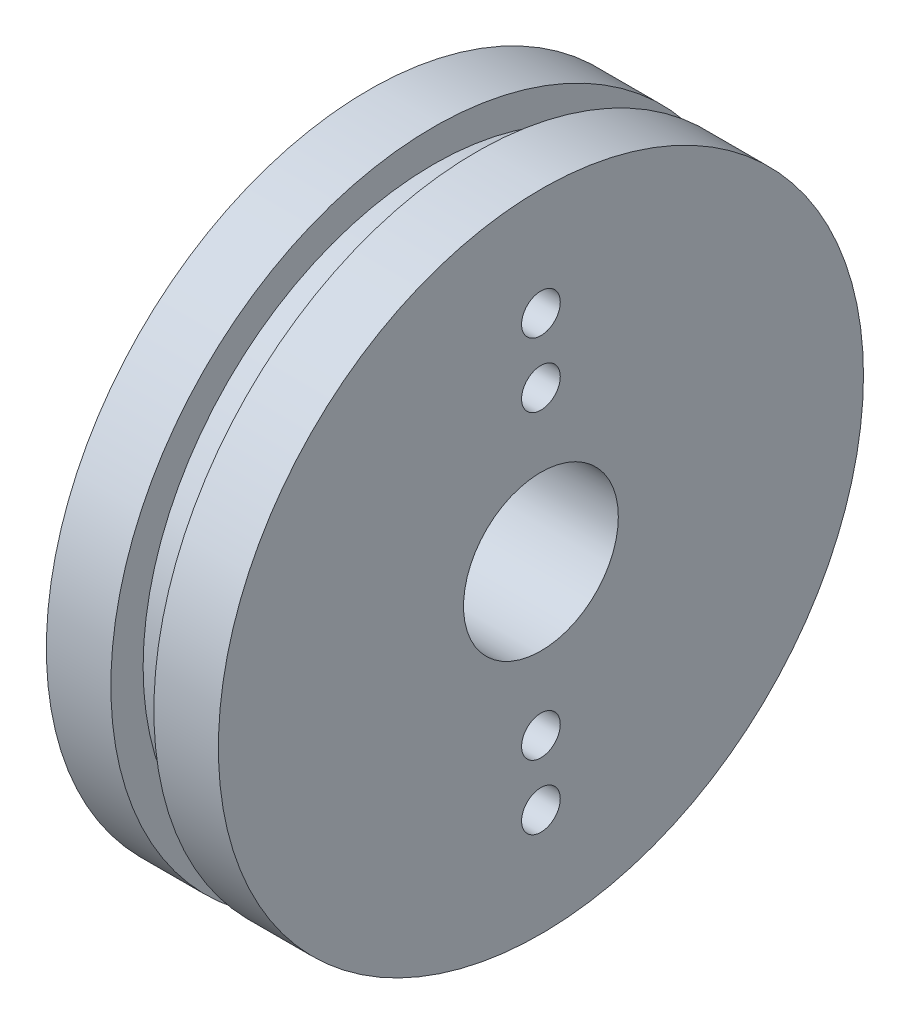
ISO-10303-21;
HEADER;
FILE_DESCRIPTION(('STEP AP214'),'2;1');
FILE_NAME('part.step','',(''),(''),'','','');
FILE_SCHEMA(('AUTOMOTIVE_DESIGN { 1 0 10303 214 1 1 1 1 }'));
ENDSEC;
DATA;
#1=APPLICATION_CONTEXT('core data for automotive mechanical design processes');
#2=APPLICATION_PROTOCOL_DEFINITION('international standard','automotive_design',2000,#1);
#3=PRODUCT_CONTEXT('',#1,'mechanical');
#4=PRODUCT('Part','Part','',(#3));
#5=PRODUCT_RELATED_PRODUCT_CATEGORY('part','',(#4));
#6=PRODUCT_DEFINITION_FORMATION('','',#4);
#7=PRODUCT_DEFINITION_CONTEXT('part definition',#1,'design');
#8=PRODUCT_DEFINITION('design','',#6,#7);
#9=PRODUCT_DEFINITION_SHAPE('','',#8);
#10=(LENGTH_UNIT() NAMED_UNIT(*) SI_UNIT(.MILLI.,.METRE.));
#11=(NAMED_UNIT(*) PLANE_ANGLE_UNIT() SI_UNIT($,.RADIAN.));
#12=(NAMED_UNIT(*) SI_UNIT($,.STERADIAN.) SOLID_ANGLE_UNIT());
#13=UNCERTAINTY_MEASURE_WITH_UNIT(LENGTH_MEASURE(1.E-05),#10,'distance_accuracy_value','');
#14=(GEOMETRIC_REPRESENTATION_CONTEXT(3) GLOBAL_UNCERTAINTY_ASSIGNED_CONTEXT((#13)) GLOBAL_UNIT_ASSIGNED_CONTEXT((#10,
#11,#12)) REPRESENTATION_CONTEXT('',''));
#15=CARTESIAN_POINT('',(0.,0.,0.));
#16=DIRECTION('',(0.,0.,1.));
#17=DIRECTION('',(1.,0.,0.));
#18=AXIS2_PLACEMENT_3D('',#15,#16,#17);
#19=CARTESIAN_POINT('',(0.,0.,0.));
#20=DIRECTION('',(1.,0.,0.));
#21=DIRECTION('',(0.,0.,-1.));
#22=AXIS2_PLACEMENT_3D('',#19,#20,#21);
#23=PLANE('',#22);
#24=CARTESIAN_POINT('',(0.,10.,0.));
#25=DIRECTION('',(1.,0.,0.));
#26=DIRECTION('',(0.,0.,-1.));
#27=AXIS2_PLACEMENT_3D('',#24,#25,#26);
#28=CIRCLE('',#27,0.9);
#29=CARTESIAN_POINT('',(0.,10.,-0.9));
#30=VERTEX_POINT('',#29);
#31=EDGE_CURVE('E78',#30,#30,#28,.F.);
#32=ORIENTED_EDGE('',*,*,#31,.F.);
#33=EDGE_LOOP('',(#32));
#34=FACE_BOUND('',#33,.T.);
#35=CARTESIAN_POINT('',(0.,7.,0.));
#36=DIRECTION('',(1.,0.,0.));
#37=DIRECTION('',(0.,0.,-1.));
#38=AXIS2_PLACEMENT_3D('',#35,#36,#37);
#39=CIRCLE('',#38,0.9);
#40=CARTESIAN_POINT('',(0.,7.,-0.9));
#41=VERTEX_POINT('',#40);
#42=EDGE_CURVE('E75',#41,#41,#39,.F.);
#43=ORIENTED_EDGE('',*,*,#42,.F.);
#44=EDGE_LOOP('',(#43));
#45=FACE_BOUND('',#44,.T.);
#46=CARTESIAN_POINT('',(0.,-7.,0.));
#47=DIRECTION('',(1.,0.,0.));
#48=DIRECTION('',(0.,0.,-1.));
#49=AXIS2_PLACEMENT_3D('',#46,#47,#48);
#50=CIRCLE('',#49,0.9);
#51=CARTESIAN_POINT('',(0.,-7.,-0.9));
#52=VERTEX_POINT('',#51);
#53=EDGE_CURVE('E72',#52,#52,#50,.F.);
#54=ORIENTED_EDGE('',*,*,#53,.F.);
#55=EDGE_LOOP('',(#54));
#56=FACE_BOUND('',#55,.T.);
#57=CARTESIAN_POINT('',(0.,-10.,0.));
#58=DIRECTION('',(1.,0.,0.));
#59=DIRECTION('',(0.,0.,-1.));
#60=AXIS2_PLACEMENT_3D('',#57,#58,#59);
#61=CIRCLE('',#60,0.9);
#62=CARTESIAN_POINT('',(0.,-10.,-0.9));
#63=VERTEX_POINT('',#62);
#64=EDGE_CURVE('E68',#63,#63,#61,.F.);
#65=ORIENTED_EDGE('',*,*,#64,.F.);
#66=EDGE_LOOP('',(#65));
#67=FACE_BOUND('',#66,.T.);
#68=CARTESIAN_POINT('',(0.,0.,0.));
#69=DIRECTION('',(1.,0.,0.));
#70=DIRECTION('',(0.,0.,-1.));
#71=AXIS2_PLACEMENT_3D('',#68,#69,#70);
#72=CIRCLE('',#71,3.6);
#73=CARTESIAN_POINT('',(0.,0.,-3.6));
#74=VERTEX_POINT('',#73);
#75=EDGE_CURVE('E67',#74,#74,#72,.F.);
#76=ORIENTED_EDGE('',*,*,#75,.F.);
#77=EDGE_LOOP('',(#76));
#78=FACE_BOUND('',#77,.T.);
#79=CARTESIAN_POINT('',(0.,0.,0.));
#80=DIRECTION('',(1.,0.,0.));
#81=DIRECTION('',(0.,0.,-1.));
#82=AXIS2_PLACEMENT_3D('',#79,#80,#81);
#83=CIRCLE('',#82,15.);
#84=CARTESIAN_POINT('',(0.,0.,-15.));
#85=VERTEX_POINT('',#84);
#86=EDGE_CURVE('E51',#85,#85,#83,.T.);
#87=ORIENTED_EDGE('',*,*,#86,.F.);
#88=EDGE_LOOP('',(#87));
#89=FACE_BOUND('',#88,.T.);
#90=ADVANCED_FACE('F43',(#34,#45,#56,#67,#78,#89),#23,.F.);
#91=CARTESIAN_POINT('',(8.,0.,0.));
#92=DIRECTION('',(-1.,0.,0.));
#93=DIRECTION('',(0.,0.,1.));
#94=AXIS2_PLACEMENT_3D('',#91,#92,#93);
#95=CYLINDRICAL_SURFACE('',#94,15.);
#96=ORIENTED_EDGE('',*,*,#86,.T.);
#97=EDGE_LOOP('',(#96));
#98=FACE_BOUND('',#97,.T.);
#99=CARTESIAN_POINT('',(3.,0.,0.));
#100=DIRECTION('',(1.,0.,0.));
#101=DIRECTION('',(0.,0.,-1.));
#102=AXIS2_PLACEMENT_3D('',#99,#100,#101);
#103=CIRCLE('',#102,15.);
#104=CARTESIAN_POINT('',(3.,0.,-15.));
#105=VERTEX_POINT('',#104);
#106=EDGE_CURVE('E56',#105,#105,#103,.T.);
#107=ORIENTED_EDGE('',*,*,#106,.F.);
#108=EDGE_LOOP('',(#107));
#109=FACE_BOUND('',#108,.T.);
#110=ADVANCED_FACE('F45',(#98,#109),#95,.T.);
#111=CARTESIAN_POINT('',(3.,0.,0.));
#112=DIRECTION('',(1.,0.,0.));
#113=DIRECTION('',(0.,0.,-1.));
#114=AXIS2_PLACEMENT_3D('',#111,#112,#113);
#115=PLANE('',#114);
#116=CARTESIAN_POINT('',(3.,0.,0.));
#117=DIRECTION('',(1.,0.,0.));
#118=DIRECTION('',(0.,0.,-1.));
#119=AXIS2_PLACEMENT_3D('',#116,#117,#118);
#120=CIRCLE('',#119,13.5);
#121=CARTESIAN_POINT('',(3.,0.,-13.5));
#122=VERTEX_POINT('',#121);
#123=EDGE_CURVE('E10',#122,#122,#120,.T.);
#124=ORIENTED_EDGE('',*,*,#123,.F.);
#125=EDGE_LOOP('',(#124));
#126=FACE_BOUND('',#125,.T.);
#127=ORIENTED_EDGE('',*,*,#106,.T.);
#128=EDGE_LOOP('',(#127));
#129=FACE_BOUND('',#128,.T.);
#130=ADVANCED_FACE('F110',(#126,#129),#115,.T.);
#131=CARTESIAN_POINT('',(5.,0.,0.));
#132=DIRECTION('',(-1.,0.,0.));
#133=DIRECTION('',(0.,0.,1.));
#134=AXIS2_PLACEMENT_3D('',#131,#132,#133);
#135=CYLINDRICAL_SURFACE('',#134,13.5);
#136=CARTESIAN_POINT('',(5.,0.,0.));
#137=DIRECTION('',(1.,0.,0.));
#138=DIRECTION('',(0.,0.,-1.));
#139=AXIS2_PLACEMENT_3D('',#136,#137,#138);
#140=CIRCLE('',#139,13.5);
#141=CARTESIAN_POINT('',(5.,0.,-13.5));
#142=VERTEX_POINT('',#141);
#143=EDGE_CURVE('E59',#142,#142,#140,.T.);
#144=ORIENTED_EDGE('',*,*,#143,.F.);
#145=EDGE_LOOP('',(#144));
#146=FACE_BOUND('',#145,.T.);
#147=ORIENTED_EDGE('',*,*,#123,.T.);
#148=EDGE_LOOP('',(#147));
#149=FACE_BOUND('',#148,.T.);
#150=ADVANCED_FACE('F107',(#146,#149),#135,.T.);
#151=CARTESIAN_POINT('',(8.,0.,0.));
#152=DIRECTION('',(-1.,0.,0.));
#153=DIRECTION('',(0.,0.,1.));
#154=AXIS2_PLACEMENT_3D('',#151,#152,#153);
#155=CYLINDRICAL_SURFACE('',#154,15.);
#156=CARTESIAN_POINT('',(5.,0.,0.));
#157=DIRECTION('',(1.,0.,0.));
#158=DIRECTION('',(0.,0.,-1.));
#159=AXIS2_PLACEMENT_3D('',#156,#157,#158);
#160=CIRCLE('',#159,15.);
#161=CARTESIAN_POINT('',(5.,0.,-15.));
#162=VERTEX_POINT('',#161);
#163=EDGE_CURVE('E95',#162,#162,#160,.T.);
#164=ORIENTED_EDGE('',*,*,#163,.T.);
#165=EDGE_LOOP('',(#164));
#166=FACE_BOUND('',#165,.T.);
#167=CARTESIAN_POINT('',(8.,0.,0.));
#168=DIRECTION('',(1.,0.,0.));
#169=DIRECTION('',(0.,0.,-1.));
#170=AXIS2_PLACEMENT_3D('',#167,#168,#169);
#171=CIRCLE('',#170,15.);
#172=CARTESIAN_POINT('',(8.,0.,-15.));
#173=VERTEX_POINT('',#172);
#174=EDGE_CURVE('E97',#173,#173,#171,.T.);
#175=ORIENTED_EDGE('',*,*,#174,.F.);
#176=EDGE_LOOP('',(#175));
#177=FACE_BOUND('',#176,.T.);
#178=ADVANCED_FACE('F109',(#166,#177),#155,.T.);
#179=CARTESIAN_POINT('',(8.,0.,0.));
#180=DIRECTION('',(1.,0.,0.));
#181=DIRECTION('',(0.,0.,-1.));
#182=AXIS2_PLACEMENT_3D('',#179,#180,#181);
#183=PLANE('',#182);
#184=CARTESIAN_POINT('',(8.,10.,0.));
#185=DIRECTION('',(1.,0.,0.));
#186=DIRECTION('',(0.,0.,-1.));
#187=AXIS2_PLACEMENT_3D('',#184,#185,#186);
#188=CIRCLE('',#187,0.9);
#189=CARTESIAN_POINT('',(8.,10.,-0.9));
#190=VERTEX_POINT('',#189);
#191=EDGE_CURVE('E47',#190,#190,#188,.F.);
#192=ORIENTED_EDGE('',*,*,#191,.T.);
#193=EDGE_LOOP('',(#192));
#194=FACE_BOUND('',#193,.T.);
#195=CARTESIAN_POINT('',(8.,7.,0.));
#196=DIRECTION('',(1.,0.,0.));
#197=DIRECTION('',(0.,0.,-1.));
#198=AXIS2_PLACEMENT_3D('',#195,#196,#197);
#199=CIRCLE('',#198,0.9);
#200=CARTESIAN_POINT('',(8.,7.,-0.9));
#201=VERTEX_POINT('',#200);
#202=EDGE_CURVE('E76',#201,#201,#199,.F.);
#203=ORIENTED_EDGE('',*,*,#202,.T.);
#204=EDGE_LOOP('',(#203));
#205=FACE_BOUND('',#204,.T.);
#206=CARTESIAN_POINT('',(8.,-7.,0.));
#207=DIRECTION('',(1.,0.,0.));
#208=DIRECTION('',(0.,0.,-1.));
#209=AXIS2_PLACEMENT_3D('',#206,#207,#208);
#210=CIRCLE('',#209,0.9);
#211=CARTESIAN_POINT('',(8.,-7.,-0.9));
#212=VERTEX_POINT('',#211);
#213=EDGE_CURVE('E73',#212,#212,#210,.F.);
#214=ORIENTED_EDGE('',*,*,#213,.T.);
#215=EDGE_LOOP('',(#214));
#216=FACE_BOUND('',#215,.T.);
#217=CARTESIAN_POINT('',(8.,-10.,0.));
#218=DIRECTION('',(1.,0.,0.));
#219=DIRECTION('',(0.,0.,-1.));
#220=AXIS2_PLACEMENT_3D('',#217,#218,#219);
#221=CIRCLE('',#220,0.9);
#222=CARTESIAN_POINT('',(8.,-10.,-0.9));
#223=VERTEX_POINT('',#222);
#224=EDGE_CURVE('E69',#223,#223,#221,.F.);
#225=ORIENTED_EDGE('',*,*,#224,.T.);
#226=EDGE_LOOP('',(#225));
#227=FACE_BOUND('',#226,.T.);
#228=CARTESIAN_POINT('',(8.,0.,0.));
#229=DIRECTION('',(1.,0.,0.));
#230=DIRECTION('',(0.,0.,-1.));
#231=AXIS2_PLACEMENT_3D('',#228,#229,#230);
#232=CIRCLE('',#231,3.6);
#233=CARTESIAN_POINT('',(8.,0.,-3.6));
#234=VERTEX_POINT('',#233);
#235=EDGE_CURVE('E64',#234,#234,#232,.F.);
#236=ORIENTED_EDGE('',*,*,#235,.T.);
#237=EDGE_LOOP('',(#236));
#238=FACE_BOUND('',#237,.T.);
#239=ORIENTED_EDGE('',*,*,#174,.T.);
#240=EDGE_LOOP('',(#239));
#241=FACE_BOUND('',#240,.T.);
#242=ADVANCED_FACE('F115',(#194,#205,#216,#227,#238,#241),#183,.T.);
#243=CARTESIAN_POINT('',(5.,0.,0.));
#244=DIRECTION('',(1.,0.,0.));
#245=DIRECTION('',(0.,0.,-1.));
#246=AXIS2_PLACEMENT_3D('',#243,#244,#245);
#247=PLANE('',#246);
#248=ORIENTED_EDGE('',*,*,#143,.T.);
#249=EDGE_LOOP('',(#248));
#250=FACE_BOUND('',#249,.T.);
#251=ORIENTED_EDGE('',*,*,#163,.F.);
#252=EDGE_LOOP('',(#251));
#253=FACE_BOUND('',#252,.T.);
#254=ADVANCED_FACE('F104',(#250,#253),#247,.F.);
#255=CARTESIAN_POINT('',(9.,0.,0.));
#256=DIRECTION('',(-1.,0.,0.));
#257=DIRECTION('',(0.,0.,1.));
#258=AXIS2_PLACEMENT_3D('',#255,#256,#257);
#259=CYLINDRICAL_SURFACE('',#258,3.6);
#260=ORIENTED_EDGE('',*,*,#235,.F.);
#261=EDGE_LOOP('',(#260));
#262=FACE_BOUND('',#261,.T.);
#263=ORIENTED_EDGE('',*,*,#75,.T.);
#264=EDGE_LOOP('',(#263));
#265=FACE_BOUND('',#264,.T.);
#266=ADVANCED_FACE('F142',(#262,#265),#259,.F.);
#267=CARTESIAN_POINT('',(9.,-10.,0.));
#268=DIRECTION('',(-1.,0.,0.));
#269=DIRECTION('',(0.,0.,1.));
#270=AXIS2_PLACEMENT_3D('',#267,#268,#269);
#271=CYLINDRICAL_SURFACE('',#270,0.9);
#272=ORIENTED_EDGE('',*,*,#224,.F.);
#273=EDGE_LOOP('',(#272));
#274=FACE_BOUND('',#273,.T.);
#275=ORIENTED_EDGE('',*,*,#64,.T.);
#276=EDGE_LOOP('',(#275));
#277=FACE_BOUND('',#276,.T.);
#278=ADVANCED_FACE('F144',(#274,#277),#271,.F.);
#279=CARTESIAN_POINT('',(9.,-7.,0.));
#280=DIRECTION('',(-1.,0.,0.));
#281=DIRECTION('',(0.,0.,1.));
#282=AXIS2_PLACEMENT_3D('',#279,#280,#281);
#283=CYLINDRICAL_SURFACE('',#282,0.9);
#284=ORIENTED_EDGE('',*,*,#213,.F.);
#285=EDGE_LOOP('',(#284));
#286=FACE_BOUND('',#285,.T.);
#287=ORIENTED_EDGE('',*,*,#53,.T.);
#288=EDGE_LOOP('',(#287));
#289=FACE_BOUND('',#288,.T.);
#290=ADVANCED_FACE('F152',(#286,#289),#283,.F.);
#291=CARTESIAN_POINT('',(9.,7.,0.));
#292=DIRECTION('',(-1.,0.,0.));
#293=DIRECTION('',(0.,0.,1.));
#294=AXIS2_PLACEMENT_3D('',#291,#292,#293);
#295=CYLINDRICAL_SURFACE('',#294,0.9);
#296=ORIENTED_EDGE('',*,*,#202,.F.);
#297=EDGE_LOOP('',(#296));
#298=FACE_BOUND('',#297,.T.);
#299=ORIENTED_EDGE('',*,*,#42,.T.);
#300=EDGE_LOOP('',(#299));
#301=FACE_BOUND('',#300,.T.);
#302=ADVANCED_FACE('F173',(#298,#301),#295,.F.);
#303=CARTESIAN_POINT('',(9.,10.,0.));
#304=DIRECTION('',(-1.,0.,0.));
#305=DIRECTION('',(0.,0.,1.));
#306=AXIS2_PLACEMENT_3D('',#303,#304,#305);
#307=CYLINDRICAL_SURFACE('',#306,0.9);
#308=ORIENTED_EDGE('',*,*,#191,.F.);
#309=EDGE_LOOP('',(#308));
#310=FACE_BOUND('',#309,.T.);
#311=ORIENTED_EDGE('',*,*,#31,.T.);
#312=EDGE_LOOP('',(#311));
#313=FACE_BOUND('',#312,.T.);
#314=ADVANCED_FACE('F178',(#310,#313),#307,.F.);
#315=CLOSED_SHELL('',(#90,#110,#130,#150,#178,#242,#254,#266,#278,#290,#302,#314));
#316=MANIFOLD_SOLID_BREP('B2',#315);
#317=ADVANCED_BREP_SHAPE_REPRESENTATION('',(#18,#316),#14);
#318=SHAPE_DEFINITION_REPRESENTATION(#9,#317);
ENDSEC;
END-ISO-10303-21;
